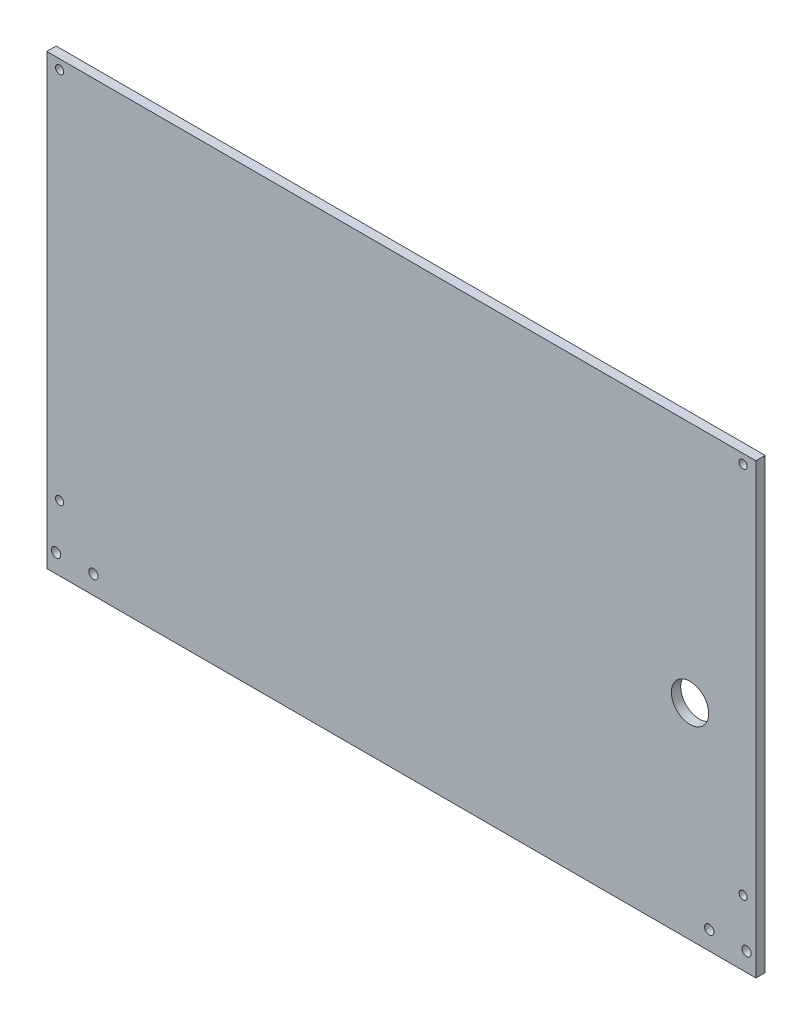
ISO-10303-21;
HEADER;
FILE_DESCRIPTION(('STEP AP214'),'2;1');
FILE_NAME('part.step','',(''),(''),'','','');
FILE_SCHEMA(('AUTOMOTIVE_DESIGN { 1 0 10303 214 1 1 1 1 }'));
ENDSEC;
DATA;
#1=APPLICATION_CONTEXT('core data for automotive mechanical design processes');
#2=APPLICATION_PROTOCOL_DEFINITION('international standard','automotive_design',2000,#1);
#3=PRODUCT_CONTEXT('',#1,'mechanical');
#4=PRODUCT('Part','Part','',(#3));
#5=PRODUCT_RELATED_PRODUCT_CATEGORY('part','',(#4));
#6=PRODUCT_DEFINITION_FORMATION('','',#4);
#7=PRODUCT_DEFINITION_CONTEXT('part definition',#1,'design');
#8=PRODUCT_DEFINITION('design','',#6,#7);
#9=PRODUCT_DEFINITION_SHAPE('','',#8);
#10=(LENGTH_UNIT() NAMED_UNIT(*) SI_UNIT(.MILLI.,.METRE.));
#11=(NAMED_UNIT(*) PLANE_ANGLE_UNIT() SI_UNIT($,.RADIAN.));
#12=(NAMED_UNIT(*) SI_UNIT($,.STERADIAN.) SOLID_ANGLE_UNIT());
#13=UNCERTAINTY_MEASURE_WITH_UNIT(LENGTH_MEASURE(1.E-05),#10,'distance_accuracy_value','');
#14=(GEOMETRIC_REPRESENTATION_CONTEXT(3) GLOBAL_UNCERTAINTY_ASSIGNED_CONTEXT((#13)) GLOBAL_UNIT_ASSIGNED_CONTEXT((#10,
#11,#12)) REPRESENTATION_CONTEXT('',''));
#15=CARTESIAN_POINT('',(0.,0.,0.));
#16=DIRECTION('',(0.,0.,1.));
#17=DIRECTION('',(1.,0.,0.));
#18=AXIS2_PLACEMENT_3D('',#15,#16,#17);
#19=CARTESIAN_POINT('',(241.3,-152.4,6.35));
#20=DIRECTION('',(-1.,0.,0.));
#21=DIRECTION('',(0.,0.,1.));
#22=AXIS2_PLACEMENT_3D('',#19,#20,#21);
#23=PLANE('',#22);
#24=DIRECTION('',(0.,1.,0.));
#25=VECTOR('',#24,1.);
#26=CARTESIAN_POINT('',(241.3,-152.4,0.));
#27=LINE('',#26,#25);
#28=CARTESIAN_POINT('',(241.3,-152.4,0.));
#29=VERTEX_POINT('',#28);
#30=CARTESIAN_POINT('',(241.3,152.4,0.));
#31=VERTEX_POINT('',#30);
#32=EDGE_CURVE('E110',#29,#31,#27,.T.);
#33=ORIENTED_EDGE('',*,*,#32,.T.);
#34=DIRECTION('',(0.,0.,-1.));
#35=VECTOR('',#34,1.);
#36=CARTESIAN_POINT('',(241.3,152.4,6.35));
#37=LINE('',#36,#35);
#38=CARTESIAN_POINT('',(241.3,152.4,6.35));
#39=VERTEX_POINT('',#38);
#40=EDGE_CURVE('E11',#39,#31,#37,.T.);
#41=ORIENTED_EDGE('',*,*,#40,.F.);
#42=DIRECTION('',(0.,1.,0.));
#43=VECTOR('',#42,1.);
#44=CARTESIAN_POINT('',(241.3,-152.4,6.35));
#45=LINE('',#44,#43);
#46=CARTESIAN_POINT('',(241.3,-152.4,6.35));
#47=VERTEX_POINT('',#46);
#48=EDGE_CURVE('E94',#47,#39,#45,.T.);
#49=ORIENTED_EDGE('',*,*,#48,.F.);
#50=DIRECTION('',(0.,0.,-1.));
#51=VECTOR('',#50,1.);
#52=CARTESIAN_POINT('',(241.3,-152.4,6.35));
#53=LINE('',#52,#51);
#54=EDGE_CURVE('E106',#47,#29,#53,.T.);
#55=ORIENTED_EDGE('',*,*,#54,.T.);
#56=EDGE_LOOP('',(#33,#41,#49,#55));
#57=FACE_BOUND('',#56,.T.);
#58=ADVANCED_FACE('F42',(#57),#23,.F.);
#59=CARTESIAN_POINT('',(-241.3,152.4,6.35));
#60=DIRECTION('',(0.,-1.,0.));
#61=DIRECTION('',(0.,0.,-1.));
#62=AXIS2_PLACEMENT_3D('',#59,#60,#61);
#63=PLANE('',#62);
#64=DIRECTION('',(-1.,0.,0.));
#65=VECTOR('',#64,1.);
#66=CARTESIAN_POINT('',(-241.3,152.4,0.));
#67=LINE('',#66,#65);
#68=CARTESIAN_POINT('',(-241.3,152.4,0.));
#69=VERTEX_POINT('',#68);
#70=EDGE_CURVE('E99',#31,#69,#67,.T.);
#71=ORIENTED_EDGE('',*,*,#70,.T.);
#72=DIRECTION('',(0.,0.,-1.));
#73=VECTOR('',#72,1.);
#74=CARTESIAN_POINT('',(-241.3,152.4,6.35));
#75=LINE('',#74,#73);
#76=CARTESIAN_POINT('',(-241.3,152.4,6.35));
#77=VERTEX_POINT('',#76);
#78=EDGE_CURVE('E51',#77,#69,#75,.T.);
#79=ORIENTED_EDGE('',*,*,#78,.F.);
#80=DIRECTION('',(-1.,0.,0.));
#81=VECTOR('',#80,1.);
#82=CARTESIAN_POINT('',(-241.3,152.4,6.35));
#83=LINE('',#82,#81);
#84=EDGE_CURVE('E89',#39,#77,#83,.T.);
#85=ORIENTED_EDGE('',*,*,#84,.F.);
#86=ORIENTED_EDGE('',*,*,#40,.T.);
#87=EDGE_LOOP('',(#71,#79,#85,#86));
#88=FACE_BOUND('',#87,.T.);
#89=ADVANCED_FACE('F98',(#88),#63,.F.);
#90=CARTESIAN_POINT('',(-241.3,-152.4,6.35));
#91=DIRECTION('',(1.,0.,0.));
#92=DIRECTION('',(0.,0.,-1.));
#93=AXIS2_PLACEMENT_3D('',#90,#91,#92);
#94=PLANE('',#93);
#95=DIRECTION('',(0.,-1.,0.));
#96=VECTOR('',#95,1.);
#97=CARTESIAN_POINT('',(-241.3,-152.4,0.));
#98=LINE('',#97,#96);
#99=CARTESIAN_POINT('',(-241.3,-152.4,0.));
#100=VERTEX_POINT('',#99);
#101=EDGE_CURVE('E76',#69,#100,#98,.T.);
#102=ORIENTED_EDGE('',*,*,#101,.T.);
#103=DIRECTION('',(0.,0.,-1.));
#104=VECTOR('',#103,1.);
#105=CARTESIAN_POINT('',(-241.3,-152.4,6.35));
#106=LINE('',#105,#104);
#107=CARTESIAN_POINT('',(-241.3,-152.4,6.35));
#108=VERTEX_POINT('',#107);
#109=EDGE_CURVE('E101',#108,#100,#106,.T.);
#110=ORIENTED_EDGE('',*,*,#109,.F.);
#111=DIRECTION('',(0.,-1.,0.));
#112=VECTOR('',#111,1.);
#113=CARTESIAN_POINT('',(-241.3,-152.4,6.35));
#114=LINE('',#113,#112);
#115=EDGE_CURVE('E92',#77,#108,#114,.T.);
#116=ORIENTED_EDGE('',*,*,#115,.F.);
#117=ORIENTED_EDGE('',*,*,#78,.T.);
#118=EDGE_LOOP('',(#102,#110,#116,#117));
#119=FACE_BOUND('',#118,.T.);
#120=ADVANCED_FACE('F102',(#119),#94,.F.);
#121=CARTESIAN_POINT('',(-241.3,-152.4,6.35));
#122=DIRECTION('',(0.,1.,0.));
#123=DIRECTION('',(0.,0.,1.));
#124=AXIS2_PLACEMENT_3D('',#121,#122,#123);
#125=PLANE('',#124);
#126=DIRECTION('',(1.,0.,0.));
#127=VECTOR('',#126,1.);
#128=CARTESIAN_POINT('',(-241.3,-152.4,0.));
#129=LINE('',#128,#127);
#130=EDGE_CURVE('E82',#100,#29,#129,.T.);
#131=ORIENTED_EDGE('',*,*,#130,.T.);
#132=ORIENTED_EDGE('',*,*,#54,.F.);
#133=DIRECTION('',(1.,0.,0.));
#134=VECTOR('',#133,1.);
#135=CARTESIAN_POINT('',(-241.3,-152.4,6.35));
#136=LINE('',#135,#134);
#137=EDGE_CURVE('E59',#108,#47,#136,.T.);
#138=ORIENTED_EDGE('',*,*,#137,.F.);
#139=ORIENTED_EDGE('',*,*,#109,.T.);
#140=EDGE_LOOP('',(#131,#132,#138,#139));
#141=FACE_BOUND('',#140,.T.);
#142=ADVANCED_FACE('F124',(#141),#125,.F.);
#143=CARTESIAN_POINT('',(0.,0.,6.35));
#144=DIRECTION('',(0.,0.,-1.));
#145=DIRECTION('',(-1.,0.,0.));
#146=AXIS2_PLACEMENT_3D('',#143,#144,#145);
#147=PLANE('',#146);
#148=CARTESIAN_POINT('',(196.469,-12.7,6.35));
#149=DIRECTION('',(0.,0.,1.));
#150=DIRECTION('',(1.,0.,0.));
#151=AXIS2_PLACEMENT_3D('',#148,#149,#150);
#152=CIRCLE('',#151,12.7);
#153=CARTESIAN_POINT('',(209.169,-12.7,6.35));
#154=VERTEX_POINT('',#153);
#155=EDGE_CURVE('E195',#154,#154,#152,.T.);
#156=ORIENTED_EDGE('',*,*,#155,.F.);
#157=EDGE_LOOP('',(#156));
#158=FACE_BOUND('',#157,.T.);
#159=CARTESIAN_POINT('',(234.95,-139.7,6.35));
#160=DIRECTION('',(0.,0.,-1.));
#161=DIRECTION('',(-1.,0.,0.));
#162=AXIS2_PLACEMENT_3D('',#159,#160,#161);
#163=CIRCLE('',#162,3.175);
#164=CARTESIAN_POINT('',(231.775,-139.7,6.35));
#165=VERTEX_POINT('',#164);
#166=EDGE_CURVE('E188',#165,#165,#163,.T.);
#167=ORIENTED_EDGE('',*,*,#166,.T.);
#168=EDGE_LOOP('',(#167));
#169=FACE_BOUND('',#168,.T.);
#170=CARTESIAN_POINT('',(209.55,-139.7,6.35));
#171=DIRECTION('',(0.,0.,-1.));
#172=DIRECTION('',(-1.,0.,0.));
#173=AXIS2_PLACEMENT_3D('',#170,#171,#172);
#174=CIRCLE('',#173,3.17499999999997);
#175=CARTESIAN_POINT('',(206.375,-139.7,6.35));
#176=VERTEX_POINT('',#175);
#177=EDGE_CURVE('E179',#176,#176,#174,.T.);
#178=ORIENTED_EDGE('',*,*,#177,.T.);
#179=EDGE_LOOP('',(#178));
#180=FACE_BOUND('',#179,.T.);
#181=CARTESIAN_POINT('',(-234.95,-139.7,6.35));
#182=DIRECTION('',(0.,0.,1.));
#183=DIRECTION('',(1.,0.,0.));
#184=AXIS2_PLACEMENT_3D('',#181,#182,#183);
#185=CIRCLE('',#184,3.175);
#186=CARTESIAN_POINT('',(-231.775,-139.7,6.35));
#187=VERTEX_POINT('',#186);
#188=EDGE_CURVE('E172',#187,#187,#185,.T.);
#189=ORIENTED_EDGE('',*,*,#188,.F.);
#190=EDGE_LOOP('',(#189));
#191=FACE_BOUND('',#190,.T.);
#192=CARTESIAN_POINT('',(-209.55,-139.7,6.35));
#193=DIRECTION('',(0.,0.,1.));
#194=DIRECTION('',(1.,0.,0.));
#195=AXIS2_PLACEMENT_3D('',#192,#193,#194);
#196=CIRCLE('',#195,3.17499999999997);
#197=CARTESIAN_POINT('',(-206.375,-139.7,6.35));
#198=VERTEX_POINT('',#197);
#199=EDGE_CURVE('E167',#198,#198,#196,.T.);
#200=ORIENTED_EDGE('',*,*,#199,.F.);
#201=EDGE_LOOP('',(#200));
#202=FACE_BOUND('',#201,.T.);
#203=CARTESIAN_POINT('',(232.5624,146.05,6.35));
#204=DIRECTION('',(0.,0.,-1.));
#205=DIRECTION('',(-1.,0.,0.));
#206=AXIS2_PLACEMENT_3D('',#203,#204,#205);
#207=CIRCLE('',#206,2.78129999999998);
#208=CARTESIAN_POINT('',(229.7811,146.05,6.35));
#209=VERTEX_POINT('',#208);
#210=EDGE_CURVE('E156',#209,#209,#207,.T.);
#211=ORIENTED_EDGE('',*,*,#210,.T.);
#212=EDGE_LOOP('',(#211));
#213=FACE_BOUND('',#212,.T.);
#214=CARTESIAN_POINT('',(232.5624,-107.95,6.35));
#215=DIRECTION('',(0.,0.,-1.));
#216=DIRECTION('',(-1.,0.,0.));
#217=AXIS2_PLACEMENT_3D('',#214,#215,#216);
#218=CIRCLE('',#217,2.78130000000001);
#219=CARTESIAN_POINT('',(229.7811,-107.95,6.35));
#220=VERTEX_POINT('',#219);
#221=EDGE_CURVE('E147',#220,#220,#218,.T.);
#222=ORIENTED_EDGE('',*,*,#221,.T.);
#223=EDGE_LOOP('',(#222));
#224=FACE_BOUND('',#223,.T.);
#225=CARTESIAN_POINT('',(-232.5624,146.05,6.35));
#226=DIRECTION('',(0.,0.,1.));
#227=DIRECTION('',(1.,0.,0.));
#228=AXIS2_PLACEMENT_3D('',#225,#226,#227);
#229=CIRCLE('',#228,2.78129999999998);
#230=CARTESIAN_POINT('',(-229.7811,146.05,6.35));
#231=VERTEX_POINT('',#230);
#232=EDGE_CURVE('E140',#231,#231,#229,.T.);
#233=ORIENTED_EDGE('',*,*,#232,.F.);
#234=EDGE_LOOP('',(#233));
#235=FACE_BOUND('',#234,.T.);
#236=CARTESIAN_POINT('',(-232.5624,-107.95,6.35));
#237=DIRECTION('',(0.,0.,1.));
#238=DIRECTION('',(1.,0.,0.));
#239=AXIS2_PLACEMENT_3D('',#236,#237,#238);
#240=CIRCLE('',#239,2.78130000000001);
#241=CARTESIAN_POINT('',(-229.7811,-107.95,6.35));
#242=VERTEX_POINT('',#241);
#243=EDGE_CURVE('E135',#242,#242,#240,.T.);
#244=ORIENTED_EDGE('',*,*,#243,.F.);
#245=EDGE_LOOP('',(#244));
#246=FACE_BOUND('',#245,.T.);
#247=ORIENTED_EDGE('',*,*,#48,.T.);
#248=ORIENTED_EDGE('',*,*,#84,.T.);
#249=ORIENTED_EDGE('',*,*,#115,.T.);
#250=ORIENTED_EDGE('',*,*,#137,.T.);
#251=EDGE_LOOP('',(#247,#248,#249,#250));
#252=FACE_BOUND('',#251,.T.);
#253=ADVANCED_FACE('F90',(#158,#169,#180,#191,#202,#213,#224,#235,#246,#252),#147,.F.);
#254=CARTESIAN_POINT('',(0.,0.,0.));
#255=DIRECTION('',(0.,0.,-1.));
#256=DIRECTION('',(-1.,0.,0.));
#257=AXIS2_PLACEMENT_3D('',#254,#255,#256);
#258=PLANE('',#257);
#259=CARTESIAN_POINT('',(196.469,-12.7,0.));
#260=DIRECTION('',(0.,0.,1.));
#261=DIRECTION('',(1.,0.,0.));
#262=AXIS2_PLACEMENT_3D('',#259,#260,#261);
#263=CIRCLE('',#262,12.7);
#264=CARTESIAN_POINT('',(209.169,-12.7,0.));
#265=VERTEX_POINT('',#264);
#266=EDGE_CURVE('E184',#265,#265,#263,.T.);
#267=ORIENTED_EDGE('',*,*,#266,.T.);
#268=EDGE_LOOP('',(#267));
#269=FACE_BOUND('',#268,.T.);
#270=CARTESIAN_POINT('',(234.95,-139.7,0.));
#271=DIRECTION('',(0.,0.,-1.));
#272=DIRECTION('',(-1.,0.,0.));
#273=AXIS2_PLACEMENT_3D('',#270,#271,#272);
#274=CIRCLE('',#273,3.175);
#275=CARTESIAN_POINT('',(231.775,-139.7,0.));
#276=VERTEX_POINT('',#275);
#277=EDGE_CURVE('E168',#276,#276,#274,.T.);
#278=ORIENTED_EDGE('',*,*,#277,.F.);
#279=EDGE_LOOP('',(#278));
#280=FACE_BOUND('',#279,.T.);
#281=CARTESIAN_POINT('',(209.55,-139.7,0.));
#282=DIRECTION('',(0.,0.,-1.));
#283=DIRECTION('',(-1.,0.,0.));
#284=AXIS2_PLACEMENT_3D('',#281,#282,#283);
#285=CIRCLE('',#284,3.17499999999997);
#286=CARTESIAN_POINT('',(206.375,-139.7,0.));
#287=VERTEX_POINT('',#286);
#288=EDGE_CURVE('E183',#287,#287,#285,.T.);
#289=ORIENTED_EDGE('',*,*,#288,.F.);
#290=EDGE_LOOP('',(#289));
#291=FACE_BOUND('',#290,.T.);
#292=CARTESIAN_POINT('',(-234.95,-139.7,0.));
#293=DIRECTION('',(0.,0.,1.));
#294=DIRECTION('',(1.,0.,0.));
#295=AXIS2_PLACEMENT_3D('',#292,#293,#294);
#296=CIRCLE('',#295,3.175);
#297=CARTESIAN_POINT('',(-231.775,-139.7,0.));
#298=VERTEX_POINT('',#297);
#299=EDGE_CURVE('E152',#298,#298,#296,.T.);
#300=ORIENTED_EDGE('',*,*,#299,.T.);
#301=EDGE_LOOP('',(#300));
#302=FACE_BOUND('',#301,.T.);
#303=CARTESIAN_POINT('',(-209.55,-139.7,0.));
#304=DIRECTION('',(0.,0.,1.));
#305=DIRECTION('',(1.,0.,0.));
#306=AXIS2_PLACEMENT_3D('',#303,#304,#305);
#307=CIRCLE('',#306,3.17499999999997);
#308=CARTESIAN_POINT('',(-206.375,-139.7,0.));
#309=VERTEX_POINT('',#308);
#310=EDGE_CURVE('E163',#309,#309,#307,.T.);
#311=ORIENTED_EDGE('',*,*,#310,.T.);
#312=EDGE_LOOP('',(#311));
#313=FACE_BOUND('',#312,.T.);
#314=CARTESIAN_POINT('',(232.5624,146.05,0.));
#315=DIRECTION('',(0.,0.,-1.));
#316=DIRECTION('',(-1.,0.,0.));
#317=AXIS2_PLACEMENT_3D('',#314,#315,#316);
#318=CIRCLE('',#317,2.78129999999998);
#319=CARTESIAN_POINT('',(229.7811,146.05,0.));
#320=VERTEX_POINT('',#319);
#321=EDGE_CURVE('E136',#320,#320,#318,.T.);
#322=ORIENTED_EDGE('',*,*,#321,.F.);
#323=EDGE_LOOP('',(#322));
#324=FACE_BOUND('',#323,.T.);
#325=CARTESIAN_POINT('',(232.5624,-107.95,0.));
#326=DIRECTION('',(0.,0.,-1.));
#327=DIRECTION('',(-1.,0.,0.));
#328=AXIS2_PLACEMENT_3D('',#325,#326,#327);
#329=CIRCLE('',#328,2.78130000000001);
#330=CARTESIAN_POINT('',(229.7811,-107.95,0.));
#331=VERTEX_POINT('',#330);
#332=EDGE_CURVE('E151',#331,#331,#329,.T.);
#333=ORIENTED_EDGE('',*,*,#332,.F.);
#334=EDGE_LOOP('',(#333));
#335=FACE_BOUND('',#334,.T.);
#336=CARTESIAN_POINT('',(-232.5624,146.05,0.));
#337=DIRECTION('',(0.,0.,1.));
#338=DIRECTION('',(1.,0.,0.));
#339=AXIS2_PLACEMENT_3D('',#336,#337,#338);
#340=CIRCLE('',#339,2.78129999999998);
#341=CARTESIAN_POINT('',(-229.7811,146.05,0.));
#342=VERTEX_POINT('',#341);
#343=EDGE_CURVE('E114',#342,#342,#340,.T.);
#344=ORIENTED_EDGE('',*,*,#343,.T.);
#345=EDGE_LOOP('',(#344));
#346=FACE_BOUND('',#345,.T.);
#347=CARTESIAN_POINT('',(-232.5624,-107.95,0.));
#348=DIRECTION('',(0.,0.,1.));
#349=DIRECTION('',(1.,0.,0.));
#350=AXIS2_PLACEMENT_3D('',#347,#348,#349);
#351=CIRCLE('',#350,2.78130000000001);
#352=CARTESIAN_POINT('',(-229.7811,-107.95,0.));
#353=VERTEX_POINT('',#352);
#354=EDGE_CURVE('E131',#353,#353,#351,.T.);
#355=ORIENTED_EDGE('',*,*,#354,.T.);
#356=EDGE_LOOP('',(#355));
#357=FACE_BOUND('',#356,.T.);
#358=ORIENTED_EDGE('',*,*,#32,.F.);
#359=ORIENTED_EDGE('',*,*,#130,.F.);
#360=ORIENTED_EDGE('',*,*,#101,.F.);
#361=ORIENTED_EDGE('',*,*,#70,.F.);
#362=EDGE_LOOP('',(#358,#359,#360,#361));
#363=FACE_BOUND('',#362,.T.);
#364=ADVANCED_FACE('F127',(#269,#280,#291,#302,#313,#324,#335,#346,#357,#363),#258,.T.);
#365=CARTESIAN_POINT('',(-232.5624,-107.95,0.));
#366=DIRECTION('',(0.,0.,1.));
#367=DIRECTION('',(1.,0.,0.));
#368=AXIS2_PLACEMENT_3D('',#365,#366,#367);
#369=CYLINDRICAL_SURFACE('',#368,2.78130000000001);
#370=ORIENTED_EDGE('',*,*,#354,.F.);
#371=EDGE_LOOP('',(#370));
#372=FACE_BOUND('',#371,.T.);
#373=ORIENTED_EDGE('',*,*,#243,.T.);
#374=EDGE_LOOP('',(#373));
#375=FACE_BOUND('',#374,.T.);
#376=ADVANCED_FACE('F231',(#372,#375),#369,.F.);
#377=CARTESIAN_POINT('',(-232.5624,146.05,0.));
#378=DIRECTION('',(0.,0.,1.));
#379=DIRECTION('',(1.,0.,0.));
#380=AXIS2_PLACEMENT_3D('',#377,#378,#379);
#381=CYLINDRICAL_SURFACE('',#380,2.78129999999998);
#382=ORIENTED_EDGE('',*,*,#343,.F.);
#383=EDGE_LOOP('',(#382));
#384=FACE_BOUND('',#383,.T.);
#385=ORIENTED_EDGE('',*,*,#232,.T.);
#386=EDGE_LOOP('',(#385));
#387=FACE_BOUND('',#386,.T.);
#388=ADVANCED_FACE('F233',(#384,#387),#381,.F.);
#389=CARTESIAN_POINT('',(232.5624,-107.95,0.));
#390=DIRECTION('',(0.,0.,1.));
#391=DIRECTION('',(1.,0.,0.));
#392=AXIS2_PLACEMENT_3D('',#389,#390,#391);
#393=CYLINDRICAL_SURFACE('',#392,2.78130000000001);
#394=ORIENTED_EDGE('',*,*,#332,.T.);
#395=EDGE_LOOP('',(#394));
#396=FACE_BOUND('',#395,.T.);
#397=ORIENTED_EDGE('',*,*,#221,.F.);
#398=EDGE_LOOP('',(#397));
#399=FACE_BOUND('',#398,.T.);
#400=ADVANCED_FACE('F240',(#396,#399),#393,.F.);
#401=CARTESIAN_POINT('',(232.5624,146.05,0.));
#402=DIRECTION('',(0.,0.,1.));
#403=DIRECTION('',(1.,0.,0.));
#404=AXIS2_PLACEMENT_3D('',#401,#402,#403);
#405=CYLINDRICAL_SURFACE('',#404,2.78129999999998);
#406=ORIENTED_EDGE('',*,*,#321,.T.);
#407=EDGE_LOOP('',(#406));
#408=FACE_BOUND('',#407,.T.);
#409=ORIENTED_EDGE('',*,*,#210,.F.);
#410=EDGE_LOOP('',(#409));
#411=FACE_BOUND('',#410,.T.);
#412=ADVANCED_FACE('F311',(#408,#411),#405,.F.);
#413=CARTESIAN_POINT('',(-209.55,-139.7,0.));
#414=DIRECTION('',(0.,0.,1.));
#415=DIRECTION('',(1.,0.,0.));
#416=AXIS2_PLACEMENT_3D('',#413,#414,#415);
#417=CYLINDRICAL_SURFACE('',#416,3.17499999999997);
#418=ORIENTED_EDGE('',*,*,#310,.F.);
#419=EDGE_LOOP('',(#418));
#420=FACE_BOUND('',#419,.T.);
#421=ORIENTED_EDGE('',*,*,#199,.T.);
#422=EDGE_LOOP('',(#421));
#423=FACE_BOUND('',#422,.T.);
#424=ADVANCED_FACE('F303',(#420,#423),#417,.F.);
#425=CARTESIAN_POINT('',(-234.95,-139.7,0.));
#426=DIRECTION('',(0.,0.,1.));
#427=DIRECTION('',(1.,0.,0.));
#428=AXIS2_PLACEMENT_3D('',#425,#426,#427);
#429=CYLINDRICAL_SURFACE('',#428,3.175);
#430=ORIENTED_EDGE('',*,*,#299,.F.);
#431=EDGE_LOOP('',(#430));
#432=FACE_BOUND('',#431,.T.);
#433=ORIENTED_EDGE('',*,*,#188,.T.);
#434=EDGE_LOOP('',(#433));
#435=FACE_BOUND('',#434,.T.);
#436=ADVANCED_FACE('F295',(#432,#435),#429,.F.);
#437=CARTESIAN_POINT('',(209.55,-139.7,0.));
#438=DIRECTION('',(0.,0.,1.));
#439=DIRECTION('',(1.,0.,0.));
#440=AXIS2_PLACEMENT_3D('',#437,#438,#439);
#441=CYLINDRICAL_SURFACE('',#440,3.17499999999997);
#442=ORIENTED_EDGE('',*,*,#288,.T.);
#443=EDGE_LOOP('',(#442));
#444=FACE_BOUND('',#443,.T.);
#445=ORIENTED_EDGE('',*,*,#177,.F.);
#446=EDGE_LOOP('',(#445));
#447=FACE_BOUND('',#446,.T.);
#448=ADVANCED_FACE('F288',(#444,#447),#441,.F.);
#449=CARTESIAN_POINT('',(234.95,-139.7,0.));
#450=DIRECTION('',(0.,0.,1.));
#451=DIRECTION('',(1.,0.,0.));
#452=AXIS2_PLACEMENT_3D('',#449,#450,#451);
#453=CYLINDRICAL_SURFACE('',#452,3.175);
#454=ORIENTED_EDGE('',*,*,#277,.T.);
#455=EDGE_LOOP('',(#454));
#456=FACE_BOUND('',#455,.T.);
#457=ORIENTED_EDGE('',*,*,#166,.F.);
#458=EDGE_LOOP('',(#457));
#459=FACE_BOUND('',#458,.T.);
#460=ADVANCED_FACE('F208',(#456,#459),#453,.F.);
#461=CARTESIAN_POINT('',(196.469,-12.7,0.));
#462=DIRECTION('',(0.,0.,1.));
#463=DIRECTION('',(1.,0.,0.));
#464=AXIS2_PLACEMENT_3D('',#461,#462,#463);
#465=CYLINDRICAL_SURFACE('',#464,12.7);
#466=ORIENTED_EDGE('',*,*,#266,.F.);
#467=EDGE_LOOP('',(#466));
#468=FACE_BOUND('',#467,.T.);
#469=ORIENTED_EDGE('',*,*,#155,.T.);
#470=EDGE_LOOP('',(#469));
#471=FACE_BOUND('',#470,.T.);
#472=ADVANCED_FACE('F205',(#468,#471),#465,.F.);
#473=CLOSED_SHELL('',(#58,#89,#120,#142,#253,#364,#376,#388,#400,#412,#424,#436,#448,#460,#472));
#474=MANIFOLD_SOLID_BREP('B2',#473);
#475=ADVANCED_BREP_SHAPE_REPRESENTATION('',(#18,#474),#14);
#476=SHAPE_DEFINITION_REPRESENTATION(#9,#475);
ENDSEC;
END-ISO-10303-21;
